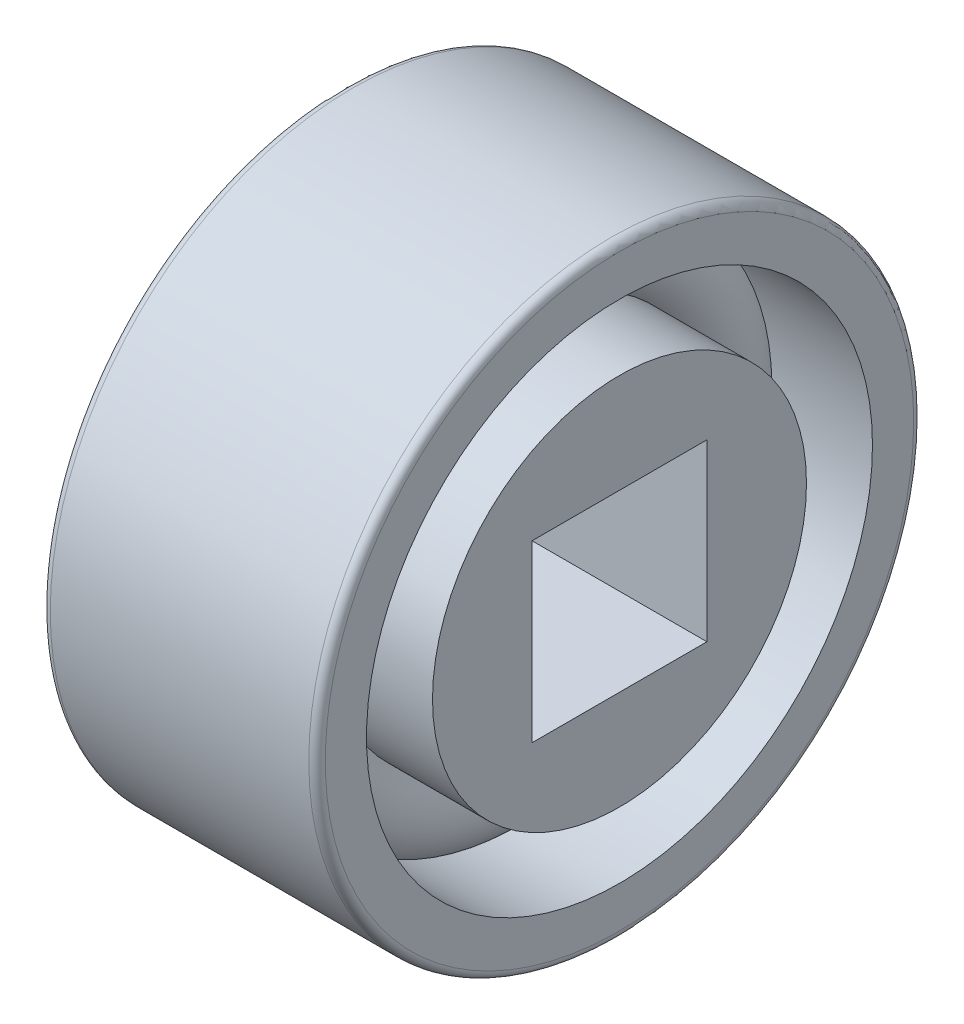
ISO-10303-21;
HEADER;
FILE_DESCRIPTION(('STEP AP214'),'2;1');
FILE_NAME('part.step','',(''),(''),'','','');
FILE_SCHEMA(('AUTOMOTIVE_DESIGN { 1 0 10303 214 1 1 1 1 }'));
ENDSEC;
DATA;
#1=APPLICATION_CONTEXT('core data for automotive mechanical design processes');
#2=APPLICATION_PROTOCOL_DEFINITION('international standard','automotive_design',2000,#1);
#3=PRODUCT_CONTEXT('',#1,'mechanical');
#4=PRODUCT('Part','Part','',(#3));
#5=PRODUCT_RELATED_PRODUCT_CATEGORY('part','',(#4));
#6=PRODUCT_DEFINITION_FORMATION('','',#4);
#7=PRODUCT_DEFINITION_CONTEXT('part definition',#1,'design');
#8=PRODUCT_DEFINITION('design','',#6,#7);
#9=PRODUCT_DEFINITION_SHAPE('','',#8);
#10=(LENGTH_UNIT() NAMED_UNIT(*) SI_UNIT(.MILLI.,.METRE.));
#11=(NAMED_UNIT(*) PLANE_ANGLE_UNIT() SI_UNIT($,.RADIAN.));
#12=(NAMED_UNIT(*) SI_UNIT($,.STERADIAN.) SOLID_ANGLE_UNIT());
#13=UNCERTAINTY_MEASURE_WITH_UNIT(LENGTH_MEASURE(1.E-05),#10,'distance_accuracy_value','');
#14=(GEOMETRIC_REPRESENTATION_CONTEXT(3) GLOBAL_UNCERTAINTY_ASSIGNED_CONTEXT((#13)) GLOBAL_UNIT_ASSIGNED_CONTEXT((#10,
#11,#12)) REPRESENTATION_CONTEXT('',''));
#15=CARTESIAN_POINT('',(0.,0.,0.));
#16=DIRECTION('',(0.,0.,1.));
#17=DIRECTION('',(1.,0.,0.));
#18=AXIS2_PLACEMENT_3D('',#15,#16,#17);
#19=CARTESIAN_POINT('',(-14.5374636300137,15.8717478253056,-3.111809802445));
#20=DIRECTION('',(-1.,0.,0.));
#21=DIRECTION('',(0.,0.,1.));
#22=AXIS2_PLACEMENT_3D('',#19,#20,#21);
#23=TOROIDAL_SURFACE('',#22,4.,0.9);
#24=CARTESIAN_POINT('',(-13.8666432367638,15.8717478253056,-3.111809802445));
#25=DIRECTION('',(-1.,0.,0.));
#26=DIRECTION('',(0.,0.,1.));
#27=AXIS2_PLACEMENT_3D('',#24,#25,#26);
#28=CIRCLE('',#27,4.6);
#29=CARTESIAN_POINT('',(-13.8666432367638,15.8717478253056,1.48819019755501));
#30=VERTEX_POINT('',#29);
#31=EDGE_CURVE('E37',#30,#30,#28,.F.);
#32=ORIENTED_EDGE('',*,*,#31,.T.);
#33=EDGE_LOOP('',(#32));
#34=FACE_BOUND('',#33,.T.);
#35=CARTESIAN_POINT('',(-13.8666432367638,15.8717478253056,-3.111809802445));
#36=DIRECTION('',(-1.,0.,0.));
#37=DIRECTION('',(0.,0.,1.));
#38=AXIS2_PLACEMENT_3D('',#35,#36,#37);
#39=CIRCLE('',#38,3.4);
#40=CARTESIAN_POINT('',(-13.8666432367638,15.8717478253056,0.288190197555));
#41=VERTEX_POINT('',#40);
#42=EDGE_CURVE('E11',#41,#41,#39,.T.);
#43=ORIENTED_EDGE('',*,*,#42,.T.);
#44=EDGE_LOOP('',(#43));
#45=FACE_BOUND('',#44,.T.);
#46=ADVANCED_FACE('F33',(#34,#45),#23,.T.);
#47=CARTESIAN_POINT('',(-35.1749636300137,15.8717478253056,-3.111809802445));
#48=DIRECTION('',(1.,0.,0.));
#49=DIRECTION('',(0.,0.,-1.));
#50=AXIS2_PLACEMENT_3D('',#47,#48,#49);
#51=CYLINDRICAL_SURFACE('',#50,3.4);
#52=CARTESIAN_POINT('',(-12.0374636300137,15.8717478253056,-3.111809802445));
#53=DIRECTION('',(1.,0.,0.));
#54=DIRECTION('',(0.,0.,-1.));
#55=AXIS2_PLACEMENT_3D('',#52,#53,#54);
#56=CIRCLE('',#55,3.4);
#57=CARTESIAN_POINT('',(-12.0374636300137,15.8717478253056,-6.511809802445));
#58=VERTEX_POINT('',#57);
#59=EDGE_CURVE('E134',#58,#58,#56,.T.);
#60=ORIENTED_EDGE('',*,*,#59,.F.);
#61=EDGE_LOOP('',(#60));
#62=FACE_BOUND('',#61,.T.);
#63=ORIENTED_EDGE('',*,*,#42,.F.);
#64=EDGE_LOOP('',(#63));
#65=FACE_BOUND('',#64,.T.);
#66=ADVANCED_FACE('F162',(#62,#65),#51,.T.);
#67=CARTESIAN_POINT('',(-35.1749636300137,15.8717478253056,-3.111809802445));
#68=DIRECTION('',(1.,0.,0.));
#69=DIRECTION('',(0.,0.,-1.));
#70=AXIS2_PLACEMENT_3D('',#67,#68,#69);
#71=CYLINDRICAL_SURFACE('',#70,3.4);
#72=CARTESIAN_POINT('',(-17.0374636300137,15.8717478253056,-3.111809802445));
#73=DIRECTION('',(1.,0.,0.));
#74=DIRECTION('',(0.,0.,-1.));
#75=AXIS2_PLACEMENT_3D('',#72,#73,#74);
#76=CIRCLE('',#75,3.4);
#77=CARTESIAN_POINT('',(-17.0374636300137,15.8717478253056,-6.511809802445));
#78=VERTEX_POINT('',#77);
#79=EDGE_CURVE('E131',#78,#78,#76,.T.);
#80=ORIENTED_EDGE('',*,*,#79,.T.);
#81=EDGE_LOOP('',(#80));
#82=FACE_BOUND('',#81,.T.);
#83=CARTESIAN_POINT('',(-15.2082840232637,15.8717478253056,-3.111809802445));
#84=DIRECTION('',(1.,0.,0.));
#85=DIRECTION('',(0.,0.,-1.));
#86=AXIS2_PLACEMENT_3D('',#83,#84,#85);
#87=CIRCLE('',#86,3.4);
#88=CARTESIAN_POINT('',(-15.2082840232637,15.8717478253056,-6.511809802445));
#89=VERTEX_POINT('',#88);
#90=EDGE_CURVE('E42',#89,#89,#87,.T.);
#91=ORIENTED_EDGE('',*,*,#90,.F.);
#92=EDGE_LOOP('',(#91));
#93=FACE_BOUND('',#92,.T.);
#94=ADVANCED_FACE('F166',(#82,#93),#71,.T.);
#95=CARTESIAN_POINT('',(-12.0374636300137,18.5217478253056,-3.111809802445));
#96=DIRECTION('',(1.,0.,0.));
#97=DIRECTION('',(0.,0.,-1.));
#98=AXIS2_PLACEMENT_3D('',#95,#96,#97);
#99=PLANE('',#98);
#100=ORIENTED_EDGE('',*,*,#59,.T.);
#101=EDGE_LOOP('',(#100));
#102=FACE_BOUND('',#101,.T.);
#103=DIRECTION('',(0.,-1.,0.));
#104=VECTOR('',#103,1.);
#105=CARTESIAN_POINT('',(-12.0374636300137,17.4617478253056,-4.701809802445));
#106=LINE('',#105,#104);
#107=CARTESIAN_POINT('',(-12.0374636300137,17.4617478253056,-4.701809802445));
#108=VERTEX_POINT('',#107);
#109=CARTESIAN_POINT('',(-12.0374636300137,14.2817478253056,-4.701809802445));
#110=VERTEX_POINT('',#109);
#111=EDGE_CURVE('E86',#108,#110,#106,.T.);
#112=ORIENTED_EDGE('',*,*,#111,.T.);
#113=DIRECTION('',(0.,0.,1.));
#114=VECTOR('',#113,1.);
#115=CARTESIAN_POINT('',(-12.0374636300137,14.2817478253056,-4.701809802445));
#116=LINE('',#115,#114);
#117=CARTESIAN_POINT('',(-12.0374636300137,14.2817478253056,-1.521809802445));
#118=VERTEX_POINT('',#117);
#119=EDGE_CURVE('E91',#110,#118,#116,.T.);
#120=ORIENTED_EDGE('',*,*,#119,.T.);
#121=DIRECTION('',(0.,1.,0.));
#122=VECTOR('',#121,1.);
#123=CARTESIAN_POINT('',(-12.0374636300137,14.2817478253056,-1.521809802445));
#124=LINE('',#123,#122);
#125=CARTESIAN_POINT('',(-12.0374636300137,17.4617478253056,-1.521809802445));
#126=VERTEX_POINT('',#125);
#127=EDGE_CURVE('E96',#118,#126,#124,.T.);
#128=ORIENTED_EDGE('',*,*,#127,.T.);
#129=DIRECTION('',(0.,0.,-1.));
#130=VECTOR('',#129,1.);
#131=CARTESIAN_POINT('',(-12.0374636300137,17.4617478253056,-1.521809802445));
#132=LINE('',#131,#130);
#133=EDGE_CURVE('E50',#126,#108,#132,.T.);
#134=ORIENTED_EDGE('',*,*,#133,.T.);
#135=EDGE_LOOP('',(#112,#120,#128,#134));
#136=FACE_BOUND('',#135,.T.);
#137=ADVANCED_FACE('F94',(#102,#136),#99,.T.);
#138=CARTESIAN_POINT('',(-17.0374636300137,19.2717478253056,-3.111809802445));
#139=DIRECTION('',(-1.,0.,0.));
#140=DIRECTION('',(0.,0.,1.));
#141=AXIS2_PLACEMENT_3D('',#138,#139,#140);
#142=PLANE('',#141);
#143=ORIENTED_EDGE('',*,*,#79,.F.);
#144=EDGE_LOOP('',(#143));
#145=FACE_BOUND('',#144,.T.);
#146=DIRECTION('',(0.,0.,1.));
#147=VECTOR('',#146,1.);
#148=CARTESIAN_POINT('',(-17.0374636300137,14.2817478253056,-4.701809802445));
#149=LINE('',#148,#147);
#150=CARTESIAN_POINT('',(-17.0374636300137,14.2817478253056,-4.701809802445));
#151=VERTEX_POINT('',#150);
#152=CARTESIAN_POINT('',(-17.0374636300137,14.2817478253056,-1.521809802445));
#153=VERTEX_POINT('',#152);
#154=EDGE_CURVE('E58',#151,#153,#149,.T.);
#155=ORIENTED_EDGE('',*,*,#154,.F.);
#156=DIRECTION('',(0.,-1.,0.));
#157=VECTOR('',#156,1.);
#158=CARTESIAN_POINT('',(-17.0374636300137,17.4617478253056,-4.701809802445));
#159=LINE('',#158,#157);
#160=CARTESIAN_POINT('',(-17.0374636300137,17.4617478253056,-4.701809802445));
#161=VERTEX_POINT('',#160);
#162=EDGE_CURVE('E105',#161,#151,#159,.T.);
#163=ORIENTED_EDGE('',*,*,#162,.F.);
#164=DIRECTION('',(0.,0.,-1.));
#165=VECTOR('',#164,1.);
#166=CARTESIAN_POINT('',(-17.0374636300137,17.4617478253056,-1.521809802445));
#167=LINE('',#166,#165);
#168=CARTESIAN_POINT('',(-17.0374636300137,17.4617478253056,-1.521809802445));
#169=VERTEX_POINT('',#168);
#170=EDGE_CURVE('E78',#169,#161,#167,.T.);
#171=ORIENTED_EDGE('',*,*,#170,.F.);
#172=DIRECTION('',(0.,1.,0.));
#173=VECTOR('',#172,1.);
#174=CARTESIAN_POINT('',(-17.0374636300137,15.8717478253056,-1.521809802445));
#175=LINE('',#174,#173);
#176=EDGE_CURVE('E101',#153,#169,#175,.T.);
#177=ORIENTED_EDGE('',*,*,#176,.F.);
#178=EDGE_LOOP('',(#155,#163,#171,#177));
#179=FACE_BOUND('',#178,.T.);
#180=ADVANCED_FACE('F158',(#145,#179),#142,.T.);
#181=CARTESIAN_POINT('',(-15.2082840232637,15.8717478253056,-3.111809802445));
#182=DIRECTION('',(1.,0.,0.));
#183=DIRECTION('',(0.,0.,-1.));
#184=AXIS2_PLACEMENT_3D('',#181,#182,#183);
#185=CIRCLE('',#184,4.6);
#186=CARTESIAN_POINT('',(-15.2082840232637,15.8717478253056,-7.711809802445));
#187=VERTEX_POINT('',#186);
#188=EDGE_CURVE('E130',#187,#187,#185,.F.);
#189=ORIENTED_EDGE('',*,*,#188,.T.);
#190=EDGE_LOOP('',(#189));
#191=FACE_BOUND('',#190,.T.);
#192=ORIENTED_EDGE('',*,*,#90,.T.);
#193=EDGE_LOOP('',(#192));
#194=FACE_BOUND('',#193,.T.);
#195=ADVANCED_FACE('F35',(#191,#194),#23,.T.);
#196=CARTESIAN_POINT('',(-35.1749636300137,15.8717478253056,-3.111809802445));
#197=DIRECTION('',(1.,0.,0.));
#198=DIRECTION('',(0.,0.,-1.));
#199=AXIS2_PLACEMENT_3D('',#196,#197,#198);
#200=CYLINDRICAL_SURFACE('',#199,4.6);
#201=CARTESIAN_POINT('',(-12.0374636300137,15.8717478253056,-3.111809802445));
#202=DIRECTION('',(1.,0.,0.));
#203=DIRECTION('',(0.,0.,-1.));
#204=AXIS2_PLACEMENT_3D('',#201,#202,#203);
#205=CIRCLE('',#204,4.6);
#206=CARTESIAN_POINT('',(-12.0374636300137,15.8717478253056,-7.711809802445));
#207=VERTEX_POINT('',#206);
#208=EDGE_CURVE('E127',#207,#207,#205,.T.);
#209=ORIENTED_EDGE('',*,*,#208,.T.);
#210=EDGE_LOOP('',(#209));
#211=FACE_BOUND('',#210,.T.);
#212=ORIENTED_EDGE('',*,*,#31,.F.);
#213=EDGE_LOOP('',(#212));
#214=FACE_BOUND('',#213,.T.);
#215=ADVANCED_FACE('F146',(#211,#214),#200,.F.);
#216=CARTESIAN_POINT('',(-35.1749636300137,15.8717478253056,-3.111809802445));
#217=DIRECTION('',(1.,0.,0.));
#218=DIRECTION('',(0.,0.,-1.));
#219=AXIS2_PLACEMENT_3D('',#216,#217,#218);
#220=CYLINDRICAL_SURFACE('',#219,4.6);
#221=CARTESIAN_POINT('',(-17.0374636300137,15.8717478253056,-3.111809802445));
#222=DIRECTION('',(1.,0.,0.));
#223=DIRECTION('',(0.,0.,-1.));
#224=AXIS2_PLACEMENT_3D('',#221,#222,#223);
#225=CIRCLE('',#224,4.6);
#226=CARTESIAN_POINT('',(-17.0374636300137,15.8717478253056,-7.711809802445));
#227=VERTEX_POINT('',#226);
#228=EDGE_CURVE('E110',#227,#227,#225,.T.);
#229=ORIENTED_EDGE('',*,*,#228,.F.);
#230=EDGE_LOOP('',(#229));
#231=FACE_BOUND('',#230,.T.);
#232=ORIENTED_EDGE('',*,*,#188,.F.);
#233=EDGE_LOOP('',(#232));
#234=FACE_BOUND('',#233,.T.);
#235=ADVANCED_FACE('F148',(#231,#234),#220,.F.);
#236=CARTESIAN_POINT('',(-12.0374636300137,21.2217478253056,-3.111809802445));
#237=DIRECTION('',(1.,0.,0.));
#238=DIRECTION('',(0.,0.,-1.));
#239=AXIS2_PLACEMENT_3D('',#236,#237,#238);
#240=PLANE('',#239);
#241=CARTESIAN_POINT('',(-12.0374636300137,15.8717478253056,-3.111809802445));
#242=DIRECTION('',(1.,0.,0.));
#243=DIRECTION('',(0.,0.,-1.));
#244=AXIS2_PLACEMENT_3D('',#241,#242,#243);
#245=CIRCLE('',#244,5.35);
#246=CARTESIAN_POINT('',(-12.0374636300137,15.8717478253056,-8.461809802445));
#247=VERTEX_POINT('',#246);
#248=EDGE_CURVE('E124',#247,#247,#245,.T.);
#249=ORIENTED_EDGE('',*,*,#248,.T.);
#250=EDGE_LOOP('',(#249));
#251=FACE_BOUND('',#250,.T.);
#252=ORIENTED_EDGE('',*,*,#208,.F.);
#253=EDGE_LOOP('',(#252));
#254=FACE_BOUND('',#253,.T.);
#255=ADVANCED_FACE('F155',(#251,#254),#240,.T.);
#256=CARTESIAN_POINT('',(-12.1874636300137,15.8717478253056,-3.111809802445));
#257=DIRECTION('',(1.,0.,0.));
#258=DIRECTION('',(0.,0.,-1.));
#259=AXIS2_PLACEMENT_3D('',#256,#257,#258);
#260=TOROIDAL_SURFACE('',#259,5.35,0.15);
#261=CARTESIAN_POINT('',(-12.1874636300137,15.8717478253056,-3.111809802445));
#262=DIRECTION('',(1.,0.,0.));
#263=DIRECTION('',(0.,0.,-1.));
#264=AXIS2_PLACEMENT_3D('',#261,#262,#263);
#265=CIRCLE('',#264,5.5);
#266=CARTESIAN_POINT('',(-12.1874636300137,15.8717478253056,-8.611809802445));
#267=VERTEX_POINT('',#266);
#268=EDGE_CURVE('E121',#267,#267,#265,.T.);
#269=ORIENTED_EDGE('',*,*,#268,.T.);
#270=EDGE_LOOP('',(#269));
#271=FACE_BOUND('',#270,.T.);
#272=ORIENTED_EDGE('',*,*,#248,.F.);
#273=EDGE_LOOP('',(#272));
#274=FACE_BOUND('',#273,.T.);
#275=ADVANCED_FACE('F210',(#271,#274),#260,.T.);
#276=CARTESIAN_POINT('',(-35.1749636300137,15.8717478253056,-3.111809802445));
#277=DIRECTION('',(1.,0.,0.));
#278=DIRECTION('',(0.,0.,-1.));
#279=AXIS2_PLACEMENT_3D('',#276,#277,#278);
#280=CYLINDRICAL_SURFACE('',#279,5.50000000000001);
#281=CARTESIAN_POINT('',(-16.8874636300137,15.8717478253056,-3.111809802445));
#282=DIRECTION('',(1.,0.,0.));
#283=DIRECTION('',(0.,0.,-1.));
#284=AXIS2_PLACEMENT_3D('',#281,#282,#283);
#285=CIRCLE('',#284,5.50000000000001);
#286=CARTESIAN_POINT('',(-16.8874636300137,15.8717478253056,-8.611809802445));
#287=VERTEX_POINT('',#286);
#288=EDGE_CURVE('E118',#287,#287,#285,.T.);
#289=ORIENTED_EDGE('',*,*,#288,.T.);
#290=EDGE_LOOP('',(#289));
#291=FACE_BOUND('',#290,.T.);
#292=ORIENTED_EDGE('',*,*,#268,.F.);
#293=EDGE_LOOP('',(#292));
#294=FACE_BOUND('',#293,.T.);
#295=ADVANCED_FACE('F206',(#291,#294),#280,.T.);
#296=CARTESIAN_POINT('',(-16.8874636300137,15.8717478253056,-3.111809802445));
#297=DIRECTION('',(1.,0.,0.));
#298=DIRECTION('',(0.,0.,-1.));
#299=AXIS2_PLACEMENT_3D('',#296,#297,#298);
#300=TOROIDAL_SURFACE('',#299,5.35,0.15);
#301=CARTESIAN_POINT('',(-17.0374636300137,15.8717478253056,-3.111809802445));
#302=DIRECTION('',(1.,0.,0.));
#303=DIRECTION('',(0.,0.,-1.));
#304=AXIS2_PLACEMENT_3D('',#301,#302,#303);
#305=CIRCLE('',#304,5.35);
#306=CARTESIAN_POINT('',(-17.0374636300137,15.8717478253056,-8.461809802445));
#307=VERTEX_POINT('',#306);
#308=EDGE_CURVE('E115',#307,#307,#305,.T.);
#309=ORIENTED_EDGE('',*,*,#308,.T.);
#310=EDGE_LOOP('',(#309));
#311=FACE_BOUND('',#310,.T.);
#312=ORIENTED_EDGE('',*,*,#288,.F.);
#313=EDGE_LOOP('',(#312));
#314=FACE_BOUND('',#313,.T.);
#315=ADVANCED_FACE('F196',(#311,#314),#300,.T.);
#316=CARTESIAN_POINT('',(-17.0374636300137,20.4717478253056,-3.111809802445));
#317=DIRECTION('',(-1.,0.,0.));
#318=DIRECTION('',(0.,0.,1.));
#319=AXIS2_PLACEMENT_3D('',#316,#317,#318);
#320=PLANE('',#319);
#321=ORIENTED_EDGE('',*,*,#228,.T.);
#322=EDGE_LOOP('',(#321));
#323=FACE_BOUND('',#322,.T.);
#324=ORIENTED_EDGE('',*,*,#308,.F.);
#325=EDGE_LOOP('',(#324));
#326=FACE_BOUND('',#325,.T.);
#327=ADVANCED_FACE('F189',(#323,#326),#320,.T.);
#328=CARTESIAN_POINT('',(-12.0374636300137,14.2817478253056,-4.701809802445));
#329=DIRECTION('',(0.,-1.,0.));
#330=DIRECTION('',(0.,0.,-1.));
#331=AXIS2_PLACEMENT_3D('',#328,#329,#330);
#332=PLANE('',#331);
#333=ORIENTED_EDGE('',*,*,#154,.T.);
#334=DIRECTION('',(-1.,0.,0.));
#335=VECTOR('',#334,1.);
#336=CARTESIAN_POINT('',(-12.0374636300137,14.2817478253056,-1.521809802445));
#337=LINE('',#336,#335);
#338=EDGE_CURVE('E108',#118,#153,#337,.T.);
#339=ORIENTED_EDGE('',*,*,#338,.F.);
#340=ORIENTED_EDGE('',*,*,#119,.F.);
#341=DIRECTION('',(-1.,0.,0.));
#342=VECTOR('',#341,1.);
#343=CARTESIAN_POINT('',(-12.0374636300137,14.2817478253056,-4.701809802445));
#344=LINE('',#343,#342);
#345=EDGE_CURVE('E82',#110,#151,#344,.T.);
#346=ORIENTED_EDGE('',*,*,#345,.T.);
#347=EDGE_LOOP('',(#333,#339,#340,#346));
#348=FACE_BOUND('',#347,.T.);
#349=ADVANCED_FACE('F187',(#348),#332,.F.);
#350=CARTESIAN_POINT('',(-12.0374636300137,17.4617478253056,-4.701809802445));
#351=DIRECTION('',(0.,0.,-1.));
#352=DIRECTION('',(-1.,0.,0.));
#353=AXIS2_PLACEMENT_3D('',#350,#351,#352);
#354=PLANE('',#353);
#355=ORIENTED_EDGE('',*,*,#162,.T.);
#356=ORIENTED_EDGE('',*,*,#345,.F.);
#357=ORIENTED_EDGE('',*,*,#111,.F.);
#358=DIRECTION('',(-1.,0.,0.));
#359=VECTOR('',#358,1.);
#360=CARTESIAN_POINT('',(-12.0374636300137,17.4617478253056,-4.701809802445));
#361=LINE('',#360,#359);
#362=EDGE_CURVE('E74',#108,#161,#361,.T.);
#363=ORIENTED_EDGE('',*,*,#362,.T.);
#364=EDGE_LOOP('',(#355,#356,#357,#363));
#365=FACE_BOUND('',#364,.T.);
#366=ADVANCED_FACE('F87',(#365),#354,.F.);
#367=CARTESIAN_POINT('',(-12.0374636300137,17.4617478253056,-1.521809802445));
#368=DIRECTION('',(0.,1.,0.));
#369=DIRECTION('',(0.,0.,1.));
#370=AXIS2_PLACEMENT_3D('',#367,#368,#369);
#371=PLANE('',#370);
#372=ORIENTED_EDGE('',*,*,#170,.T.);
#373=ORIENTED_EDGE('',*,*,#362,.F.);
#374=ORIENTED_EDGE('',*,*,#133,.F.);
#375=DIRECTION('',(-1.,0.,0.));
#376=VECTOR('',#375,1.);
#377=CARTESIAN_POINT('',(-12.0374636300137,17.4617478253056,-1.521809802445));
#378=LINE('',#377,#376);
#379=EDGE_CURVE('E83',#126,#169,#378,.T.);
#380=ORIENTED_EDGE('',*,*,#379,.T.);
#381=EDGE_LOOP('',(#372,#373,#374,#380));
#382=FACE_BOUND('',#381,.T.);
#383=ADVANCED_FACE('F76',(#382),#371,.F.);
#384=CARTESIAN_POINT('',(-12.0374636300137,15.8717478253056,-1.521809802445));
#385=DIRECTION('',(0.,0.,1.));
#386=DIRECTION('',(1.,0.,0.));
#387=AXIS2_PLACEMENT_3D('',#384,#385,#386);
#388=PLANE('',#387);
#389=ORIENTED_EDGE('',*,*,#176,.T.);
#390=ORIENTED_EDGE('',*,*,#379,.F.);
#391=ORIENTED_EDGE('',*,*,#127,.F.);
#392=ORIENTED_EDGE('',*,*,#338,.T.);
#393=EDGE_LOOP('',(#389,#390,#391,#392));
#394=FACE_BOUND('',#393,.T.);
#395=ADVANCED_FACE('F186',(#394),#388,.F.);
#396=CLOSED_SHELL('',(#46,#66,#94,#137,#180,#195,#215,#235,#255,#275,#295,#315,#327,#349,#366,
#383,#395));
#397=MANIFOLD_SOLID_BREP('B2',#396);
#398=ADVANCED_BREP_SHAPE_REPRESENTATION('',(#18,#397),#14);
#399=SHAPE_DEFINITION_REPRESENTATION(#9,#398);
ENDSEC;
END-ISO-10303-21;
